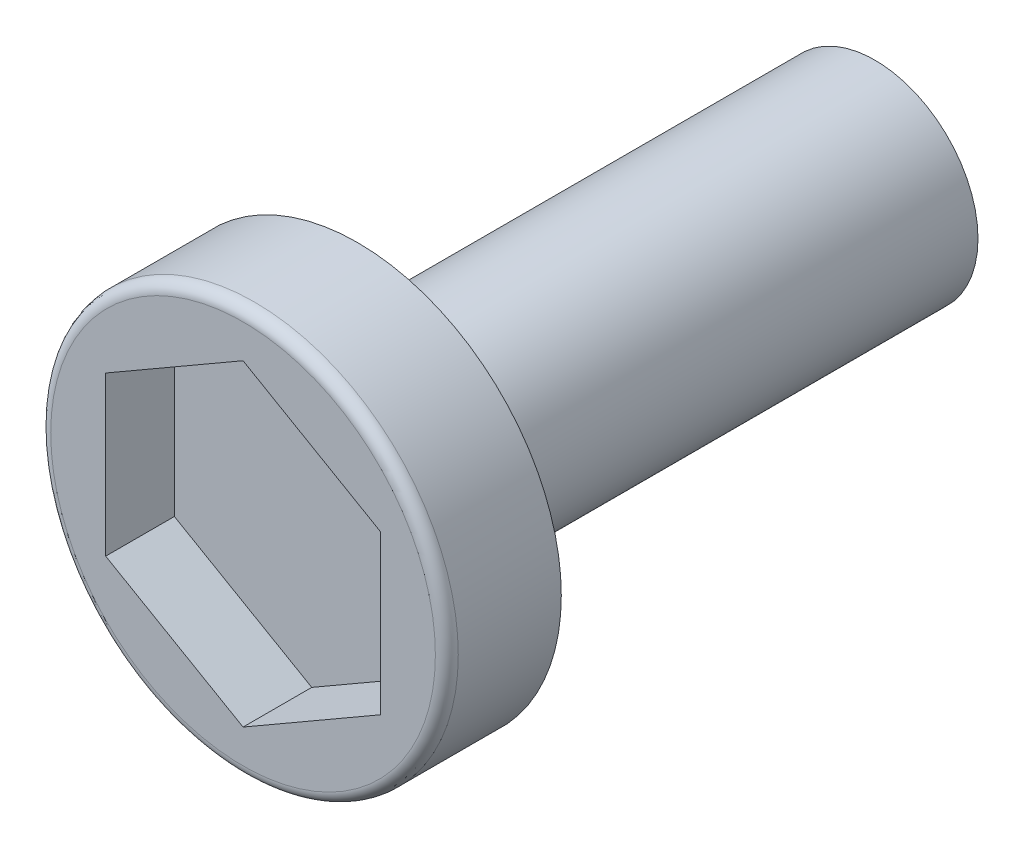
ISO-10303-21;
HEADER;
FILE_DESCRIPTION(('STEP AP214'),'2;1');
FILE_NAME('part.step','',(''),(''),'','','');
FILE_SCHEMA(('AUTOMOTIVE_DESIGN { 1 0 10303 214 1 1 1 1 }'));
ENDSEC;
DATA;
#1=APPLICATION_CONTEXT('core data for automotive mechanical design processes');
#2=APPLICATION_PROTOCOL_DEFINITION('international standard','automotive_design',2000,#1);
#3=PRODUCT_CONTEXT('',#1,'mechanical');
#4=PRODUCT('Part','Part','',(#3));
#5=PRODUCT_RELATED_PRODUCT_CATEGORY('part','',(#4));
#6=PRODUCT_DEFINITION_FORMATION('','',#4);
#7=PRODUCT_DEFINITION_CONTEXT('part definition',#1,'design');
#8=PRODUCT_DEFINITION('design','',#6,#7);
#9=PRODUCT_DEFINITION_SHAPE('','',#8);
#10=(LENGTH_UNIT() NAMED_UNIT(*) SI_UNIT(.MILLI.,.METRE.));
#11=(NAMED_UNIT(*) PLANE_ANGLE_UNIT() SI_UNIT($,.RADIAN.));
#12=(NAMED_UNIT(*) SI_UNIT($,.STERADIAN.) SOLID_ANGLE_UNIT());
#13=UNCERTAINTY_MEASURE_WITH_UNIT(LENGTH_MEASURE(1.E-05),#10,'distance_accuracy_value','');
#14=(GEOMETRIC_REPRESENTATION_CONTEXT(3) GLOBAL_UNCERTAINTY_ASSIGNED_CONTEXT((#13)) GLOBAL_UNIT_ASSIGNED_CONTEXT((#10,
#11,#12)) REPRESENTATION_CONTEXT('',''));
#15=CARTESIAN_POINT('',(0.,0.,0.));
#16=DIRECTION('',(0.,0.,1.));
#17=DIRECTION('',(1.,0.,0.));
#18=AXIS2_PLACEMENT_3D('',#15,#16,#17);
#19=CARTESIAN_POINT('',(0.,0.,5.));
#20=DIRECTION('',(0.,0.,-1.));
#21=DIRECTION('',(-1.,0.,0.));
#22=AXIS2_PLACEMENT_3D('',#19,#20,#21);
#23=CYLINDRICAL_SURFACE('',#22,8.9);
#24=CARTESIAN_POINT('',(0.,0.,4.5));
#25=DIRECTION('',(0.,0.,1.));
#26=DIRECTION('',(1.,0.,0.));
#27=AXIS2_PLACEMENT_3D('',#24,#25,#26);
#28=CIRCLE('',#27,8.9);
#29=CARTESIAN_POINT('',(8.9,0.,4.5));
#30=VERTEX_POINT('',#29);
#31=EDGE_CURVE('E38',#30,#30,#28,.F.);
#32=ORIENTED_EDGE('',*,*,#31,.T.);
#33=EDGE_LOOP('',(#32));
#34=FACE_BOUND('',#33,.T.);
#35=CARTESIAN_POINT('',(0.,0.,0.));
#36=DIRECTION('',(0.,0.,1.));
#37=DIRECTION('',(1.,0.,0.));
#38=AXIS2_PLACEMENT_3D('',#35,#36,#37);
#39=CIRCLE('',#38,8.9);
#40=CARTESIAN_POINT('',(8.9,0.,0.));
#41=VERTEX_POINT('',#40);
#42=EDGE_CURVE('E138',#41,#41,#39,.T.);
#43=ORIENTED_EDGE('',*,*,#42,.T.);
#44=EDGE_LOOP('',(#43));
#45=FACE_BOUND('',#44,.T.);
#46=ADVANCED_FACE('F34',(#34,#45),#23,.T.);
#47=CARTESIAN_POINT('',(0.,0.,5.));
#48=DIRECTION('',(0.,0.,1.));
#49=DIRECTION('',(1.,0.,0.));
#50=AXIS2_PLACEMENT_3D('',#47,#48,#49);
#51=PLANE('',#50);
#52=CARTESIAN_POINT('',(0.,0.,5.));
#53=DIRECTION('',(0.,0.,1.));
#54=DIRECTION('',(1.,0.,0.));
#55=AXIS2_PLACEMENT_3D('',#52,#53,#54);
#56=CIRCLE('',#55,8.4);
#57=CARTESIAN_POINT('',(8.4,0.,5.));
#58=VERTEX_POINT('',#57);
#59=EDGE_CURVE('E145',#58,#58,#56,.T.);
#60=ORIENTED_EDGE('',*,*,#59,.T.);
#61=EDGE_LOOP('',(#60));
#62=FACE_BOUND('',#61,.T.);
#63=DIRECTION('',(0.,-1.,0.));
#64=VECTOR('',#63,1.);
#65=CARTESIAN_POINT('',(-6.,3.46410161513775,5.));
#66=LINE('',#65,#64);
#67=CARTESIAN_POINT('',(-6.,3.46410161513775,5.));
#68=VERTEX_POINT('',#67);
#69=CARTESIAN_POINT('',(-6.,-3.46410161513776,5.));
#70=VERTEX_POINT('',#69);
#71=EDGE_CURVE('E50',#68,#70,#66,.T.);
#72=ORIENTED_EDGE('',*,*,#71,.F.);
#73=DIRECTION('',(-0.866025403784438,-0.5,0.));
#74=VECTOR('',#73,1.);
#75=CARTESIAN_POINT('',(0.,6.92820323027551,5.));
#76=LINE('',#75,#74);
#77=CARTESIAN_POINT('',(0.,6.92820323027551,5.));
#78=VERTEX_POINT('',#77);
#79=EDGE_CURVE('E134',#78,#68,#76,.T.);
#80=ORIENTED_EDGE('',*,*,#79,.F.);
#81=DIRECTION('',(-0.866025403784439,0.5,0.));
#82=VECTOR('',#81,1.);
#83=CARTESIAN_POINT('',(5.99999999999999,3.46410161513776,5.));
#84=LINE('',#83,#82);
#85=CARTESIAN_POINT('',(5.99999999999999,3.46410161513776,5.));
#86=VERTEX_POINT('',#85);
#87=EDGE_CURVE('E132',#86,#78,#84,.T.);
#88=ORIENTED_EDGE('',*,*,#87,.F.);
#89=DIRECTION('',(0.,1.,0.));
#90=VECTOR('',#89,1.);
#91=CARTESIAN_POINT('',(6.,-3.46410161513775,5.));
#92=LINE('',#91,#90);
#93=CARTESIAN_POINT('',(6.,-3.46410161513775,5.));
#94=VERTEX_POINT('',#93);
#95=EDGE_CURVE('E98',#94,#86,#92,.T.);
#96=ORIENTED_EDGE('',*,*,#95,.F.);
#97=DIRECTION('',(0.866025403784438,0.5,0.));
#98=VECTOR('',#97,1.);
#99=CARTESIAN_POINT('',(0.,-6.92820323027551,5.));
#100=LINE('',#99,#98);
#101=CARTESIAN_POINT('',(0.,-6.92820323027551,5.));
#102=VERTEX_POINT('',#101);
#103=EDGE_CURVE('E128',#102,#94,#100,.T.);
#104=ORIENTED_EDGE('',*,*,#103,.F.);
#105=DIRECTION('',(0.866025403784439,-0.5,0.));
#106=VECTOR('',#105,1.);
#107=CARTESIAN_POINT('',(-6.,-3.46410161513776,5.));
#108=LINE('',#107,#106);
#109=EDGE_CURVE('E124',#70,#102,#108,.T.);
#110=ORIENTED_EDGE('',*,*,#109,.F.);
#111=EDGE_LOOP('',(#72,#80,#88,#96,#104,#110));
#112=FACE_BOUND('',#111,.T.);
#113=ADVANCED_FACE('F167',(#62,#112),#51,.T.);
#114=CARTESIAN_POINT('',(0.,0.,0.));
#115=DIRECTION('',(0.,0.,1.));
#116=DIRECTION('',(1.,0.,0.));
#117=AXIS2_PLACEMENT_3D('',#114,#115,#116);
#118=PLANE('',#117);
#119=CARTESIAN_POINT('',(0.,0.,0.));
#120=DIRECTION('',(0.,0.,-1.));
#121=DIRECTION('',(-1.,0.,0.));
#122=AXIS2_PLACEMENT_3D('',#119,#120,#121);
#123=CIRCLE('',#122,4.5);
#124=CARTESIAN_POINT('',(-4.5,0.,0.));
#125=VERTEX_POINT('',#124);
#126=EDGE_CURVE('E11',#125,#125,#123,.T.);
#127=ORIENTED_EDGE('',*,*,#126,.F.);
#128=EDGE_LOOP('',(#127));
#129=FACE_BOUND('',#128,.T.);
#130=ORIENTED_EDGE('',*,*,#42,.F.);
#131=EDGE_LOOP('',(#130));
#132=FACE_BOUND('',#131,.T.);
#133=ADVANCED_FACE('F171',(#129,#132),#118,.F.);
#134=CARTESIAN_POINT('',(-6.,3.46410161513775,2.));
#135=DIRECTION('',(-1.,0.,0.));
#136=DIRECTION('',(0.,-1.,0.));
#137=AXIS2_PLACEMENT_3D('',#134,#135,#136);
#138=PLANE('',#137);
#139=ORIENTED_EDGE('',*,*,#71,.T.);
#140=DIRECTION('',(0.,0.,1.));
#141=VECTOR('',#140,1.);
#142=CARTESIAN_POINT('',(-6.,-3.46410161513776,2.));
#143=LINE('',#142,#141);
#144=CARTESIAN_POINT('',(-6.,-3.46410161513776,2.));
#145=VERTEX_POINT('',#144);
#146=EDGE_CURVE('E80',#145,#70,#143,.T.);
#147=ORIENTED_EDGE('',*,*,#146,.F.);
#148=DIRECTION('',(0.,-1.,0.));
#149=VECTOR('',#148,1.);
#150=CARTESIAN_POINT('',(-6.,3.46410161513775,2.));
#151=LINE('',#150,#149);
#152=CARTESIAN_POINT('',(-6.,3.46410161513775,2.));
#153=VERTEX_POINT('',#152);
#154=EDGE_CURVE('E136',#153,#145,#151,.T.);
#155=ORIENTED_EDGE('',*,*,#154,.F.);
#156=DIRECTION('',(0.,0.,1.));
#157=VECTOR('',#156,1.);
#158=CARTESIAN_POINT('',(-6.,3.46410161513775,2.));
#159=LINE('',#158,#157);
#160=EDGE_CURVE('E58',#153,#68,#159,.T.);
#161=ORIENTED_EDGE('',*,*,#160,.T.);
#162=EDGE_LOOP('',(#139,#147,#155,#161));
#163=FACE_BOUND('',#162,.T.);
#164=ADVANCED_FACE('F175',(#163),#138,.F.);
#165=CARTESIAN_POINT('',(0.,6.92820323027551,2.));
#166=DIRECTION('',(-0.5,0.866025403784439,0.));
#167=DIRECTION('',(-0.866025403784439,-0.5,0.));
#168=AXIS2_PLACEMENT_3D('',#165,#166,#167);
#169=PLANE('',#168);
#170=ORIENTED_EDGE('',*,*,#79,.T.);
#171=ORIENTED_EDGE('',*,*,#160,.F.);
#172=DIRECTION('',(-0.866025403784438,-0.5,0.));
#173=VECTOR('',#172,1.);
#174=CARTESIAN_POINT('',(0.,6.92820323027551,2.));
#175=LINE('',#174,#173);
#176=CARTESIAN_POINT('',(0.,6.92820323027551,2.));
#177=VERTEX_POINT('',#176);
#178=EDGE_CURVE('E110',#177,#153,#175,.T.);
#179=ORIENTED_EDGE('',*,*,#178,.F.);
#180=DIRECTION('',(0.,0.,1.));
#181=VECTOR('',#180,1.);
#182=CARTESIAN_POINT('',(0.,6.92820323027551,2.));
#183=LINE('',#182,#181);
#184=EDGE_CURVE('E102',#177,#78,#183,.T.);
#185=ORIENTED_EDGE('',*,*,#184,.T.);
#186=EDGE_LOOP('',(#170,#171,#179,#185));
#187=FACE_BOUND('',#186,.T.);
#188=ADVANCED_FACE('F180',(#187),#169,.F.);
#189=CARTESIAN_POINT('',(5.99999999999999,3.46410161513776,2.));
#190=DIRECTION('',(0.5,0.866025403784439,0.));
#191=DIRECTION('',(-0.866025403784439,0.5,0.));
#192=AXIS2_PLACEMENT_3D('',#189,#190,#191);
#193=PLANE('',#192);
#194=ORIENTED_EDGE('',*,*,#87,.T.);
#195=ORIENTED_EDGE('',*,*,#184,.F.);
#196=DIRECTION('',(-0.866025403784439,0.5,0.));
#197=VECTOR('',#196,1.);
#198=CARTESIAN_POINT('',(5.99999999999999,3.46410161513776,2.));
#199=LINE('',#198,#197);
#200=CARTESIAN_POINT('',(5.99999999999999,3.46410161513776,2.));
#201=VERTEX_POINT('',#200);
#202=EDGE_CURVE('E106',#201,#177,#199,.T.);
#203=ORIENTED_EDGE('',*,*,#202,.F.);
#204=DIRECTION('',(0.,0.,1.));
#205=VECTOR('',#204,1.);
#206=CARTESIAN_POINT('',(5.99999999999999,3.46410161513776,2.));
#207=LINE('',#206,#205);
#208=EDGE_CURVE('E91',#201,#86,#207,.T.);
#209=ORIENTED_EDGE('',*,*,#208,.T.);
#210=EDGE_LOOP('',(#194,#195,#203,#209));
#211=FACE_BOUND('',#210,.T.);
#212=ADVANCED_FACE('F107',(#211),#193,.F.);
#213=CARTESIAN_POINT('',(6.,-3.46410161513775,2.));
#214=DIRECTION('',(1.,0.,0.));
#215=DIRECTION('',(0.,1.,0.));
#216=AXIS2_PLACEMENT_3D('',#213,#214,#215);
#217=PLANE('',#216);
#218=ORIENTED_EDGE('',*,*,#95,.T.);
#219=ORIENTED_EDGE('',*,*,#208,.F.);
#220=DIRECTION('',(0.,1.,0.));
#221=VECTOR('',#220,1.);
#222=CARTESIAN_POINT('',(6.,-3.46410161513775,2.));
#223=LINE('',#222,#221);
#224=CARTESIAN_POINT('',(6.,-3.46410161513775,2.));
#225=VERTEX_POINT('',#224);
#226=EDGE_CURVE('E95',#225,#201,#223,.T.);
#227=ORIENTED_EDGE('',*,*,#226,.F.);
#228=DIRECTION('',(0.,0.,1.));
#229=VECTOR('',#228,1.);
#230=CARTESIAN_POINT('',(6.,-3.46410161513775,2.));
#231=LINE('',#230,#229);
#232=EDGE_CURVE('E103',#225,#94,#231,.T.);
#233=ORIENTED_EDGE('',*,*,#232,.T.);
#234=EDGE_LOOP('',(#218,#219,#227,#233));
#235=FACE_BOUND('',#234,.T.);
#236=ADVANCED_FACE('F93',(#235),#217,.F.);
#237=CARTESIAN_POINT('',(0.,-6.92820323027551,2.));
#238=DIRECTION('',(0.5,-0.866025403784438,0.));
#239=DIRECTION('',(0.866025403784439,0.5,0.));
#240=AXIS2_PLACEMENT_3D('',#237,#238,#239);
#241=PLANE('',#240);
#242=ORIENTED_EDGE('',*,*,#103,.T.);
#243=ORIENTED_EDGE('',*,*,#232,.F.);
#244=DIRECTION('',(0.866025403784438,0.5,0.));
#245=VECTOR('',#244,1.);
#246=CARTESIAN_POINT('',(0.,-6.92820323027551,2.));
#247=LINE('',#246,#245);
#248=CARTESIAN_POINT('',(0.,-6.92820323027551,2.));
#249=VERTEX_POINT('',#248);
#250=EDGE_CURVE('E116',#249,#225,#247,.T.);
#251=ORIENTED_EDGE('',*,*,#250,.F.);
#252=DIRECTION('',(0.,0.,1.));
#253=VECTOR('',#252,1.);
#254=CARTESIAN_POINT('',(0.,-6.92820323027551,2.));
#255=LINE('',#254,#253);
#256=EDGE_CURVE('E141',#249,#102,#255,.T.);
#257=ORIENTED_EDGE('',*,*,#256,.T.);
#258=EDGE_LOOP('',(#242,#243,#251,#257));
#259=FACE_BOUND('',#258,.T.);
#260=ADVANCED_FACE('F183',(#259),#241,.F.);
#261=CARTESIAN_POINT('',(-6.,-3.46410161513776,2.));
#262=DIRECTION('',(-0.5,-0.866025403784439,0.));
#263=DIRECTION('',(0.866025403784439,-0.5,0.));
#264=AXIS2_PLACEMENT_3D('',#261,#262,#263);
#265=PLANE('',#264);
#266=ORIENTED_EDGE('',*,*,#109,.T.);
#267=ORIENTED_EDGE('',*,*,#256,.F.);
#268=DIRECTION('',(0.866025403784439,-0.5,0.));
#269=VECTOR('',#268,1.);
#270=CARTESIAN_POINT('',(-6.,-3.46410161513776,2.));
#271=LINE('',#270,#269);
#272=EDGE_CURVE('E118',#145,#249,#271,.T.);
#273=ORIENTED_EDGE('',*,*,#272,.F.);
#274=ORIENTED_EDGE('',*,*,#146,.T.);
#275=EDGE_LOOP('',(#266,#267,#273,#274));
#276=FACE_BOUND('',#275,.T.);
#277=ADVANCED_FACE('F164',(#276),#265,.F.);
#278=CARTESIAN_POINT('',(0.,0.,2.));
#279=DIRECTION('',(0.,0.,1.));
#280=DIRECTION('',(1.,0.,0.));
#281=AXIS2_PLACEMENT_3D('',#278,#279,#280);
#282=PLANE('',#281);
#283=ORIENTED_EDGE('',*,*,#154,.T.);
#284=ORIENTED_EDGE('',*,*,#272,.T.);
#285=ORIENTED_EDGE('',*,*,#250,.T.);
#286=ORIENTED_EDGE('',*,*,#226,.T.);
#287=ORIENTED_EDGE('',*,*,#202,.T.);
#288=ORIENTED_EDGE('',*,*,#178,.T.);
#289=EDGE_LOOP('',(#283,#284,#285,#286,#287,#288));
#290=FACE_BOUND('',#289,.T.);
#291=ADVANCED_FACE('F113',(#290),#282,.T.);
#292=CARTESIAN_POINT('',(0.,0.,4.5));
#293=DIRECTION('',(0.,0.,1.));
#294=DIRECTION('',(1.,0.,0.));
#295=AXIS2_PLACEMENT_3D('',#292,#293,#294);
#296=TOROIDAL_SURFACE('',#295,8.4,0.5);
#297=ORIENTED_EDGE('',*,*,#31,.F.);
#298=EDGE_LOOP('',(#297));
#299=FACE_BOUND('',#298,.T.);
#300=ORIENTED_EDGE('',*,*,#59,.F.);
#301=EDGE_LOOP('',(#300));
#302=FACE_BOUND('',#301,.T.);
#303=ADVANCED_FACE('F36',(#299,#302),#296,.T.);
#304=CARTESIAN_POINT('',(0.,0.,-22.6));
#305=DIRECTION('',(0.,0.,1.));
#306=DIRECTION('',(1.,0.,0.));
#307=AXIS2_PLACEMENT_3D('',#304,#305,#306);
#308=CYLINDRICAL_SURFACE('',#307,4.5);
#309=CARTESIAN_POINT('',(0.,0.,-22.6));
#310=DIRECTION('',(0.,0.,-1.));
#311=DIRECTION('',(-1.,0.,0.));
#312=AXIS2_PLACEMENT_3D('',#309,#310,#311);
#313=CIRCLE('',#312,4.5);
#314=CARTESIAN_POINT('',(-4.5,0.,-22.6));
#315=VERTEX_POINT('',#314);
#316=EDGE_CURVE('E125',#315,#315,#313,.T.);
#317=ORIENTED_EDGE('',*,*,#316,.F.);
#318=EDGE_LOOP('',(#317));
#319=FACE_BOUND('',#318,.T.);
#320=ORIENTED_EDGE('',*,*,#126,.T.);
#321=EDGE_LOOP('',(#320));
#322=FACE_BOUND('',#321,.T.);
#323=ADVANCED_FACE('F156',(#319,#322),#308,.T.);
#324=CARTESIAN_POINT('',(0.,0.,-22.6));
#325=DIRECTION('',(0.,0.,-1.));
#326=DIRECTION('',(-1.,0.,0.));
#327=AXIS2_PLACEMENT_3D('',#324,#325,#326);
#328=PLANE('',#327);
#329=ORIENTED_EDGE('',*,*,#316,.T.);
#330=EDGE_LOOP('',(#329));
#331=FACE_BOUND('',#330,.T.);
#332=ADVANCED_FACE('F161',(#331),#328,.T.);
#333=CLOSED_SHELL('',(#46,#113,#133,#164,#188,#212,#236,#260,#277,#291,#303,#323,#332));
#334=MANIFOLD_SOLID_BREP('B2',#333);
#335=ADVANCED_BREP_SHAPE_REPRESENTATION('',(#18,#334),#14);
#336=SHAPE_DEFINITION_REPRESENTATION(#9,#335);
ENDSEC;
END-ISO-10303-21;
